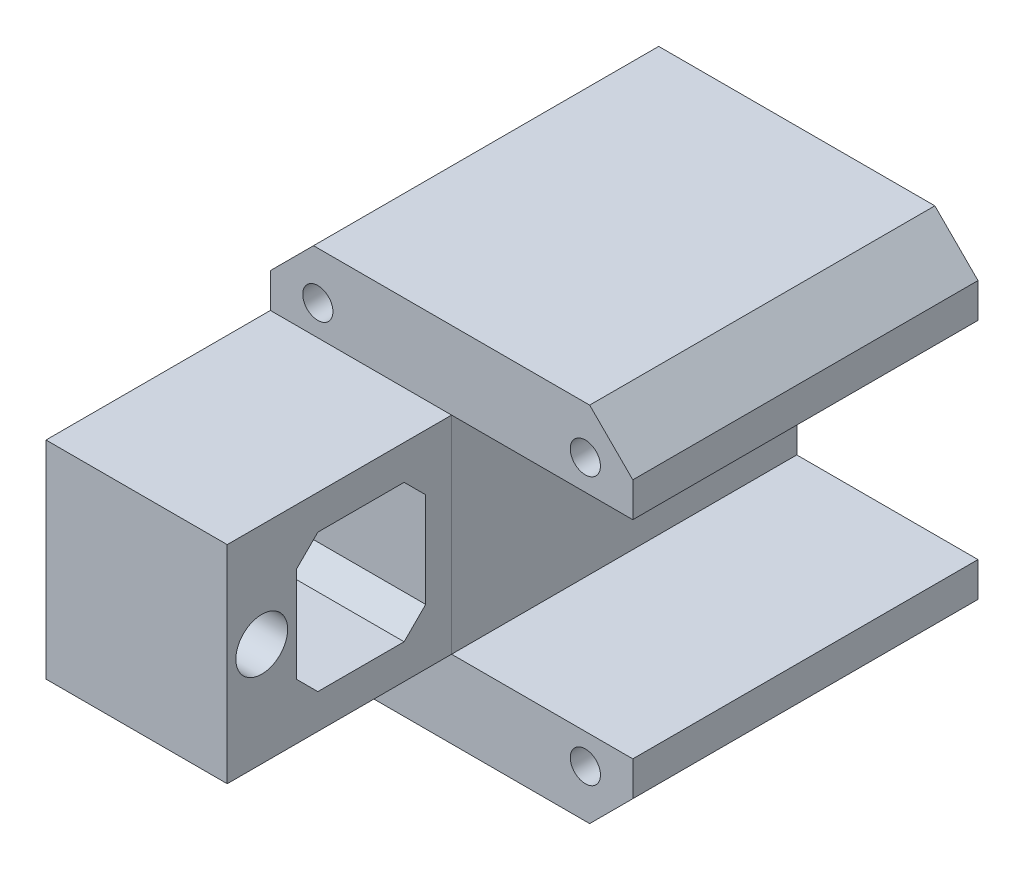
ISO-10303-21;
HEADER;
FILE_DESCRIPTION(('STEP AP214'),'2;1');
FILE_NAME('part.step','',(''),(''),'','','');
FILE_SCHEMA(('AUTOMOTIVE_DESIGN { 1 0 10303 214 1 1 1 1 }'));
ENDSEC;
DATA;
#1=APPLICATION_CONTEXT('core data for automotive mechanical design processes');
#2=APPLICATION_PROTOCOL_DEFINITION('international standard','automotive_design',2000,#1);
#3=PRODUCT_CONTEXT('',#1,'mechanical');
#4=PRODUCT('Part','Part','',(#3));
#5=PRODUCT_RELATED_PRODUCT_CATEGORY('part','',(#4));
#6=PRODUCT_DEFINITION_FORMATION('','',#4);
#7=PRODUCT_DEFINITION_CONTEXT('part definition',#1,'design');
#8=PRODUCT_DEFINITION('design','',#6,#7);
#9=PRODUCT_DEFINITION_SHAPE('','',#8);
#10=(LENGTH_UNIT() NAMED_UNIT(*) SI_UNIT(.MILLI.,.METRE.));
#11=(NAMED_UNIT(*) PLANE_ANGLE_UNIT() SI_UNIT($,.RADIAN.));
#12=(NAMED_UNIT(*) SI_UNIT($,.STERADIAN.) SOLID_ANGLE_UNIT());
#13=UNCERTAINTY_MEASURE_WITH_UNIT(LENGTH_MEASURE(1.E-05),#10,'distance_accuracy_value','');
#14=(GEOMETRIC_REPRESENTATION_CONTEXT(3) GLOBAL_UNCERTAINTY_ASSIGNED_CONTEXT((#13)) GLOBAL_UNIT_ASSIGNED_CONTEXT((#10,
#11,#12)) REPRESENTATION_CONTEXT('',''));
#15=CARTESIAN_POINT('',(0.,0.,0.));
#16=DIRECTION('',(0.,0.,1.));
#17=DIRECTION('',(1.,0.,0.));
#18=AXIS2_PLACEMENT_3D('',#15,#16,#17);
#19=CARTESIAN_POINT('',(0.,12.,40.));
#20=DIRECTION('',(0.,0.,-1.));
#21=DIRECTION('',(-1.,0.,0.));
#22=AXIS2_PLACEMENT_3D('',#19,#20,#21);
#23=PLANE('',#22);
#24=DIRECTION('',(0.,-1.,0.));
#25=VECTOR('',#24,1.);
#26=CARTESIAN_POINT('',(-21.,12.,40.));
#27=LINE('',#26,#25);
#28=CARTESIAN_POINT('',(-21.,12.,40.));
#29=VERTEX_POINT('',#28);
#30=CARTESIAN_POINT('',(-21.,-12.,40.));
#31=VERTEX_POINT('',#30);
#32=EDGE_CURVE('E168',#29,#31,#27,.T.);
#33=ORIENTED_EDGE('',*,*,#32,.F.);
#34=DIRECTION('',(-1.,0.,0.));
#35=VECTOR('',#34,1.);
#36=CARTESIAN_POINT('',(0.,12.,40.));
#37=LINE('',#36,#35);
#38=CARTESIAN_POINT('',(0.,12.,40.));
#39=VERTEX_POINT('',#38);
#40=EDGE_CURVE('E156',#39,#29,#37,.T.);
#41=ORIENTED_EDGE('',*,*,#40,.F.);
#42=DIRECTION('',(0.,-1.,0.));
#43=VECTOR('',#42,1.);
#44=CARTESIAN_POINT('',(0.,12.,40.));
#45=LINE('',#44,#43);
#46=CARTESIAN_POINT('',(0.,-12.,40.));
#47=VERTEX_POINT('',#46);
#48=EDGE_CURVE('E151',#39,#47,#45,.T.);
#49=ORIENTED_EDGE('',*,*,#48,.T.);
#50=DIRECTION('',(-1.,0.,0.));
#51=VECTOR('',#50,1.);
#52=CARTESIAN_POINT('',(0.,-12.,40.));
#53=LINE('',#52,#51);
#54=EDGE_CURVE('E133',#47,#31,#53,.T.);
#55=ORIENTED_EDGE('',*,*,#54,.T.);
#56=EDGE_LOOP('',(#33,#41,#49,#55));
#57=FACE_BOUND('',#56,.T.);
#58=ADVANCED_FACE('F43',(#57),#23,.T.);
#59=CARTESIAN_POINT('',(0.,12.,40.));
#60=DIRECTION('',(0.,1.,0.));
#61=DIRECTION('',(0.,0.,1.));
#62=AXIS2_PLACEMENT_3D('',#59,#60,#61);
#63=PLANE('',#62);
#64=DIRECTION('',(0.,0.,-1.));
#65=VECTOR('',#64,1.);
#66=CARTESIAN_POINT('',(-21.,12.,40.));
#67=LINE('',#66,#65);
#68=CARTESIAN_POINT('',(-21.,12.,66.));
#69=VERTEX_POINT('',#68);
#70=EDGE_CURVE('E157',#69,#29,#67,.T.);
#71=ORIENTED_EDGE('',*,*,#70,.F.);
#72=DIRECTION('',(-1.,0.,0.));
#73=VECTOR('',#72,1.);
#74=CARTESIAN_POINT('',(0.,12.,66.));
#75=LINE('',#74,#73);
#76=CARTESIAN_POINT('',(0.,12.,66.));
#77=VERTEX_POINT('',#76);
#78=EDGE_CURVE('E176',#77,#69,#75,.T.);
#79=ORIENTED_EDGE('',*,*,#78,.F.);
#80=DIRECTION('',(0.,0.,-1.));
#81=VECTOR('',#80,1.);
#82=CARTESIAN_POINT('',(0.,12.,40.));
#83=LINE('',#82,#81);
#84=EDGE_CURVE('E144',#77,#39,#83,.T.);
#85=ORIENTED_EDGE('',*,*,#84,.T.);
#86=ORIENTED_EDGE('',*,*,#40,.T.);
#87=EDGE_LOOP('',(#71,#79,#85,#86));
#88=FACE_BOUND('',#87,.T.);
#89=ADVANCED_FACE('F256',(#88),#63,.T.);
#90=CARTESIAN_POINT('',(0.,12.,66.));
#91=DIRECTION('',(0.,0.,1.));
#92=DIRECTION('',(1.,0.,0.));
#93=AXIS2_PLACEMENT_3D('',#90,#91,#92);
#94=PLANE('',#93);
#95=DIRECTION('',(0.,1.,0.));
#96=VECTOR('',#95,1.);
#97=CARTESIAN_POINT('',(-21.,12.,66.));
#98=LINE('',#97,#96);
#99=CARTESIAN_POINT('',(-21.,-12.,66.));
#100=VERTEX_POINT('',#99);
#101=EDGE_CURVE('E160',#100,#69,#98,.T.);
#102=ORIENTED_EDGE('',*,*,#101,.F.);
#103=DIRECTION('',(-1.,0.,0.));
#104=VECTOR('',#103,1.);
#105=CARTESIAN_POINT('',(0.,-12.,66.));
#106=LINE('',#105,#104);
#107=CARTESIAN_POINT('',(0.,-12.,66.));
#108=VERTEX_POINT('',#107);
#109=EDGE_CURVE('E143',#108,#100,#106,.T.);
#110=ORIENTED_EDGE('',*,*,#109,.F.);
#111=DIRECTION('',(0.,1.,0.));
#112=VECTOR('',#111,1.);
#113=CARTESIAN_POINT('',(0.,12.,66.));
#114=LINE('',#113,#112);
#115=EDGE_CURVE('E154',#108,#77,#114,.T.);
#116=ORIENTED_EDGE('',*,*,#115,.T.);
#117=ORIENTED_EDGE('',*,*,#78,.T.);
#118=EDGE_LOOP('',(#102,#110,#116,#117));
#119=FACE_BOUND('',#118,.T.);
#120=ADVANCED_FACE('F261',(#119),#94,.T.);
#121=CARTESIAN_POINT('',(0.,-12.,40.));
#122=DIRECTION('',(0.,-1.,0.));
#123=DIRECTION('',(0.,0.,-1.));
#124=AXIS2_PLACEMENT_3D('',#121,#122,#123);
#125=PLANE('',#124);
#126=DIRECTION('',(0.,0.,1.));
#127=VECTOR('',#126,1.);
#128=CARTESIAN_POINT('',(-21.,-12.,40.));
#129=LINE('',#128,#127);
#130=EDGE_CURVE('E138',#31,#100,#129,.T.);
#131=ORIENTED_EDGE('',*,*,#130,.F.);
#132=ORIENTED_EDGE('',*,*,#54,.F.);
#133=DIRECTION('',(0.,0.,1.));
#134=VECTOR('',#133,1.);
#135=CARTESIAN_POINT('',(0.,-12.,40.));
#136=LINE('',#135,#134);
#137=EDGE_CURVE('E136',#47,#108,#136,.T.);
#138=ORIENTED_EDGE('',*,*,#137,.T.);
#139=ORIENTED_EDGE('',*,*,#109,.T.);
#140=EDGE_LOOP('',(#131,#132,#138,#139));
#141=FACE_BOUND('',#140,.T.);
#142=ADVANCED_FACE('F135',(#141),#125,.T.);
#143=CARTESIAN_POINT('',(0.,0.,0.));
#144=DIRECTION('',(-1.,0.,0.));
#145=DIRECTION('',(0.,0.,1.));
#146=AXIS2_PLACEMENT_3D('',#143,#144,#145);
#147=PLANE('',#146);
#148=CARTESIAN_POINT('',(0.,0.,62.));
#149=DIRECTION('',(1.,0.,0.));
#150=DIRECTION('',(0.,0.,-1.));
#151=AXIS2_PLACEMENT_3D('',#148,#149,#150);
#152=CIRCLE('',#151,3.);
#153=CARTESIAN_POINT('',(0.,0.,59.));
#154=VERTEX_POINT('',#153);
#155=EDGE_CURVE('E283',#154,#154,#152,.T.);
#156=ORIENTED_EDGE('',*,*,#155,.F.);
#157=EDGE_LOOP('',(#156));
#158=FACE_BOUND('',#157,.T.);
#159=DIRECTION('',(0.,1.,0.));
#160=VECTOR('',#159,1.);
#161=CARTESIAN_POINT('',(0.,8.,58.));
#162=LINE('',#161,#160);
#163=CARTESIAN_POINT('',(0.,-5.49999999999998,58.));
#164=VERTEX_POINT('',#163);
#165=CARTESIAN_POINT('',(0.,5.50000000000001,58.));
#166=VERTEX_POINT('',#165);
#167=EDGE_CURVE('E224',#164,#166,#162,.T.);
#168=ORIENTED_EDGE('',*,*,#167,.T.);
#169=DIRECTION('',(0.,-0.707106781186544,0.707106781186551));
#170=VECTOR('',#169,1.);
#171=CARTESIAN_POINT('',(0.,31.75,31.7499999999997));
#172=LINE('',#171,#170);
#173=CARTESIAN_POINT('',(0.,8.,55.5));
#174=VERTEX_POINT('',#173);
#175=EDGE_CURVE('E12',#166,#174,#172,.F.);
#176=ORIENTED_EDGE('',*,*,#175,.T.);
#177=DIRECTION('',(0.,0.,-1.));
#178=VECTOR('',#177,1.);
#179=CARTESIAN_POINT('',(0.,8.,43.));
#180=LINE('',#179,#178);
#181=CARTESIAN_POINT('',(0.,8.,45.5));
#182=VERTEX_POINT('',#181);
#183=EDGE_CURVE('E170',#174,#182,#180,.T.);
#184=ORIENTED_EDGE('',*,*,#183,.T.);
#185=DIRECTION('',(0.,0.707106781186551,0.707106781186544));
#186=VECTOR('',#185,1.);
#187=CARTESIAN_POINT('',(0.,-18.75,18.7500000000002));
#188=LINE('',#187,#186);
#189=CARTESIAN_POINT('',(0.,5.49999999999999,43.));
#190=VERTEX_POINT('',#189);
#191=EDGE_CURVE('E203',#182,#190,#188,.F.);
#192=ORIENTED_EDGE('',*,*,#191,.T.);
#193=DIRECTION('',(0.,-1.,0.));
#194=VECTOR('',#193,1.);
#195=CARTESIAN_POINT('',(0.,8.,43.));
#196=LINE('',#195,#194);
#197=CARTESIAN_POINT('',(0.,-5.50000000000001,43.));
#198=VERTEX_POINT('',#197);
#199=EDGE_CURVE('E280',#190,#198,#196,.T.);
#200=ORIENTED_EDGE('',*,*,#199,.T.);
#201=DIRECTION('',(0.,0.707106781186544,-0.707106781186551));
#202=VECTOR('',#201,1.);
#203=CARTESIAN_POINT('',(0.,18.75,18.7499999999998));
#204=LINE('',#203,#202);
#205=CARTESIAN_POINT('',(0.,-8.,45.5));
#206=VERTEX_POINT('',#205);
#207=EDGE_CURVE('E199',#198,#206,#204,.F.);
#208=ORIENTED_EDGE('',*,*,#207,.T.);
#209=DIRECTION('',(0.,0.,1.));
#210=VECTOR('',#209,1.);
#211=CARTESIAN_POINT('',(0.,-8.,43.));
#212=LINE('',#211,#210);
#213=CARTESIAN_POINT('',(0.,-8.,55.5));
#214=VERTEX_POINT('',#213);
#215=EDGE_CURVE('E229',#206,#214,#212,.T.);
#216=ORIENTED_EDGE('',*,*,#215,.T.);
#217=DIRECTION('',(0.,-0.707106781186551,-0.707106781186544));
#218=VECTOR('',#217,1.);
#219=CARTESIAN_POINT('',(0.,-31.75,31.7500000000003));
#220=LINE('',#219,#218);
#221=EDGE_CURVE('E65',#214,#164,#220,.F.);
#222=ORIENTED_EDGE('',*,*,#221,.T.);
#223=EDGE_LOOP('',(#168,#176,#184,#192,#200,#208,#216,#222));
#224=FACE_BOUND('',#223,.T.);
#225=ORIENTED_EDGE('',*,*,#48,.F.);
#226=ORIENTED_EDGE('',*,*,#84,.F.);
#227=ORIENTED_EDGE('',*,*,#115,.F.);
#228=ORIENTED_EDGE('',*,*,#137,.F.);
#229=EDGE_LOOP('',(#225,#226,#227,#228));
#230=FACE_BOUND('',#229,.T.);
#231=ADVANCED_FACE('F149',(#158,#224,#230),#147,.F.);
#232=CARTESIAN_POINT('',(-21.,0.,0.));
#233=DIRECTION('',(-1.,0.,0.));
#234=DIRECTION('',(0.,0.,1.));
#235=AXIS2_PLACEMENT_3D('',#232,#233,#234);
#236=PLANE('',#235);
#237=DIRECTION('',(0.,-1.,0.));
#238=VECTOR('',#237,1.);
#239=CARTESIAN_POINT('',(-21.,8.,43.));
#240=LINE('',#239,#238);
#241=CARTESIAN_POINT('',(-21.,5.49999999999999,43.));
#242=VERTEX_POINT('',#241);
#243=CARTESIAN_POINT('',(-21.,-5.50000000000001,43.));
#244=VERTEX_POINT('',#243);
#245=EDGE_CURVE('E233',#242,#244,#240,.T.);
#246=ORIENTED_EDGE('',*,*,#245,.F.);
#247=DIRECTION('',(0.,-0.707106781186551,-0.707106781186544));
#248=VECTOR('',#247,1.);
#249=CARTESIAN_POINT('',(-21.,5.49999999999999,43.));
#250=LINE('',#249,#248);
#251=CARTESIAN_POINT('',(-21.,8.,45.5));
#252=VERTEX_POINT('',#251);
#253=EDGE_CURVE('E201',#242,#252,#250,.F.);
#254=ORIENTED_EDGE('',*,*,#253,.T.);
#255=DIRECTION('',(0.,0.,-1.));
#256=VECTOR('',#255,1.);
#257=CARTESIAN_POINT('',(-21.,8.,43.));
#258=LINE('',#257,#256);
#259=CARTESIAN_POINT('',(-21.,8.,55.5));
#260=VERTEX_POINT('',#259);
#261=EDGE_CURVE('E163',#260,#252,#258,.T.);
#262=ORIENTED_EDGE('',*,*,#261,.F.);
#263=DIRECTION('',(0.,0.707106781186544,-0.707106781186551));
#264=VECTOR('',#263,1.);
#265=CARTESIAN_POINT('',(-21.,8.,55.5));
#266=LINE('',#265,#264);
#267=CARTESIAN_POINT('',(-21.,5.50000000000001,58.));
#268=VERTEX_POINT('',#267);
#269=EDGE_CURVE('E51',#260,#268,#266,.F.);
#270=ORIENTED_EDGE('',*,*,#269,.T.);
#271=DIRECTION('',(0.,1.,0.));
#272=VECTOR('',#271,1.);
#273=CARTESIAN_POINT('',(-21.,8.,58.));
#274=LINE('',#273,#272);
#275=CARTESIAN_POINT('',(-21.,-5.49999999999998,58.));
#276=VERTEX_POINT('',#275);
#277=EDGE_CURVE('E213',#276,#268,#274,.T.);
#278=ORIENTED_EDGE('',*,*,#277,.F.);
#279=DIRECTION('',(0.,0.707106781186551,0.707106781186544));
#280=VECTOR('',#279,1.);
#281=CARTESIAN_POINT('',(-21.,-5.49999999999998,58.));
#282=LINE('',#281,#280);
#283=CARTESIAN_POINT('',(-21.,-8.,55.5));
#284=VERTEX_POINT('',#283);
#285=EDGE_CURVE('E205',#276,#284,#282,.F.);
#286=ORIENTED_EDGE('',*,*,#285,.T.);
#287=DIRECTION('',(0.,0.,1.));
#288=VECTOR('',#287,1.);
#289=CARTESIAN_POINT('',(-21.,-8.,43.));
#290=LINE('',#289,#288);
#291=CARTESIAN_POINT('',(-21.,-8.,45.5));
#292=VERTEX_POINT('',#291);
#293=EDGE_CURVE('E219',#292,#284,#290,.T.);
#294=ORIENTED_EDGE('',*,*,#293,.F.);
#295=DIRECTION('',(0.,-0.707106781186544,0.707106781186551));
#296=VECTOR('',#295,1.);
#297=CARTESIAN_POINT('',(-21.,-8.,45.5));
#298=LINE('',#297,#296);
#299=EDGE_CURVE('E197',#292,#244,#298,.F.);
#300=ORIENTED_EDGE('',*,*,#299,.T.);
#301=EDGE_LOOP('',(#246,#254,#262,#270,#278,#286,#294,#300));
#302=FACE_BOUND('',#301,.T.);
#303=ORIENTED_EDGE('',*,*,#32,.T.);
#304=ORIENTED_EDGE('',*,*,#130,.T.);
#305=ORIENTED_EDGE('',*,*,#101,.T.);
#306=ORIENTED_EDGE('',*,*,#70,.T.);
#307=EDGE_LOOP('',(#303,#304,#305,#306));
#308=FACE_BOUND('',#307,.T.);
#309=ADVANCED_FACE('F211',(#302,#308),#236,.T.);
#310=CARTESIAN_POINT('',(0.,8.,43.));
#311=DIRECTION('',(0.,0.,-1.));
#312=DIRECTION('',(-1.,0.,0.));
#313=AXIS2_PLACEMENT_3D('',#310,#311,#312);
#314=PLANE('',#313);
#315=ORIENTED_EDGE('',*,*,#245,.T.);
#316=DIRECTION('',(1.,0.,0.));
#317=VECTOR('',#316,1.);
#318=CARTESIAN_POINT('',(0.,-5.50000000000001,43.));
#319=LINE('',#318,#317);
#320=EDGE_CURVE('E186',#244,#198,#319,.T.);
#321=ORIENTED_EDGE('',*,*,#320,.T.);
#322=ORIENTED_EDGE('',*,*,#199,.F.);
#323=DIRECTION('',(-1.,0.,0.));
#324=VECTOR('',#323,1.);
#325=CARTESIAN_POINT('',(-21.,5.49999999999999,43.));
#326=LINE('',#325,#324);
#327=EDGE_CURVE('E183',#190,#242,#326,.T.);
#328=ORIENTED_EDGE('',*,*,#327,.T.);
#329=EDGE_LOOP('',(#315,#321,#322,#328));
#330=FACE_BOUND('',#329,.T.);
#331=ADVANCED_FACE('F300',(#330),#314,.F.);
#332=CARTESIAN_POINT('',(0.,8.,43.));
#333=DIRECTION('',(0.,1.,0.));
#334=DIRECTION('',(0.,0.,1.));
#335=AXIS2_PLACEMENT_3D('',#332,#333,#334);
#336=PLANE('',#335);
#337=ORIENTED_EDGE('',*,*,#261,.T.);
#338=DIRECTION('',(1.,0.,0.));
#339=VECTOR('',#338,1.);
#340=CARTESIAN_POINT('',(0.,8.,45.5));
#341=LINE('',#340,#339);
#342=EDGE_CURVE('E191',#252,#182,#341,.T.);
#343=ORIENTED_EDGE('',*,*,#342,.T.);
#344=ORIENTED_EDGE('',*,*,#183,.F.);
#345=DIRECTION('',(-1.,0.,0.));
#346=VECTOR('',#345,1.);
#347=CARTESIAN_POINT('',(-21.,8.,55.5));
#348=LINE('',#347,#346);
#349=EDGE_CURVE('E188',#174,#260,#348,.T.);
#350=ORIENTED_EDGE('',*,*,#349,.T.);
#351=EDGE_LOOP('',(#337,#343,#344,#350));
#352=FACE_BOUND('',#351,.T.);
#353=ADVANCED_FACE('F226',(#352),#336,.F.);
#354=CARTESIAN_POINT('',(0.,8.,58.));
#355=DIRECTION('',(0.,0.,1.));
#356=DIRECTION('',(1.,0.,0.));
#357=AXIS2_PLACEMENT_3D('',#354,#355,#356);
#358=PLANE('',#357);
#359=ORIENTED_EDGE('',*,*,#167,.F.);
#360=DIRECTION('',(-1.,0.,0.));
#361=VECTOR('',#360,1.);
#362=CARTESIAN_POINT('',(-21.,-5.49999999999998,58.));
#363=LINE('',#362,#361);
#364=EDGE_CURVE('E194',#164,#276,#363,.T.);
#365=ORIENTED_EDGE('',*,*,#364,.T.);
#366=ORIENTED_EDGE('',*,*,#277,.T.);
#367=DIRECTION('',(1.,0.,0.));
#368=VECTOR('',#367,1.);
#369=CARTESIAN_POINT('',(0.,5.50000000000001,58.));
#370=LINE('',#369,#368);
#371=EDGE_CURVE('E58',#268,#166,#370,.T.);
#372=ORIENTED_EDGE('',*,*,#371,.T.);
#373=EDGE_LOOP('',(#359,#365,#366,#372));
#374=FACE_BOUND('',#373,.T.);
#375=ADVANCED_FACE('F217',(#374),#358,.F.);
#376=CARTESIAN_POINT('',(0.,-8.,43.));
#377=DIRECTION('',(0.,-1.,0.));
#378=DIRECTION('',(0.,0.,-1.));
#379=AXIS2_PLACEMENT_3D('',#376,#377,#378);
#380=PLANE('',#379);
#381=ORIENTED_EDGE('',*,*,#215,.F.);
#382=DIRECTION('',(-1.,0.,0.));
#383=VECTOR('',#382,1.);
#384=CARTESIAN_POINT('',(-21.,-8.,45.5));
#385=LINE('',#384,#383);
#386=EDGE_CURVE('E180',#206,#292,#385,.T.);
#387=ORIENTED_EDGE('',*,*,#386,.T.);
#388=ORIENTED_EDGE('',*,*,#293,.T.);
#389=DIRECTION('',(1.,0.,0.));
#390=VECTOR('',#389,1.);
#391=CARTESIAN_POINT('',(0.,-8.,55.5));
#392=LINE('',#391,#390);
#393=EDGE_CURVE('E175',#284,#214,#392,.T.);
#394=ORIENTED_EDGE('',*,*,#393,.T.);
#395=EDGE_LOOP('',(#381,#387,#388,#394));
#396=FACE_BOUND('',#395,.T.);
#397=ADVANCED_FACE('F242',(#396),#380,.F.);
#398=CARTESIAN_POINT('',(-10.,0.,62.));
#399=DIRECTION('',(1.,0.,0.));
#400=DIRECTION('',(0.,0.,-1.));
#401=AXIS2_PLACEMENT_3D('',#398,#399,#400);
#402=CYLINDRICAL_SURFACE('',#401,3.);
#403=CARTESIAN_POINT('',(-10.,0.,62.));
#404=DIRECTION('',(1.,0.,0.));
#405=DIRECTION('',(0.,0.,-1.));
#406=AXIS2_PLACEMENT_3D('',#403,#404,#405);
#407=CIRCLE('',#406,3.);
#408=CARTESIAN_POINT('',(-10.,0.,59.));
#409=VERTEX_POINT('',#408);
#410=EDGE_CURVE('E236',#409,#409,#407,.T.);
#411=ORIENTED_EDGE('',*,*,#410,.F.);
#412=EDGE_LOOP('',(#411));
#413=FACE_BOUND('',#412,.T.);
#414=ORIENTED_EDGE('',*,*,#155,.T.);
#415=EDGE_LOOP('',(#414));
#416=FACE_BOUND('',#415,.T.);
#417=ADVANCED_FACE('F273',(#413,#416),#402,.F.);
#418=CARTESIAN_POINT('',(-10.,0.,62.));
#419=DIRECTION('',(1.,0.,0.));
#420=DIRECTION('',(0.,0.,-1.));
#421=AXIS2_PLACEMENT_3D('',#418,#419,#420);
#422=PLANE('',#421);
#423=ORIENTED_EDGE('',*,*,#410,.T.);
#424=EDGE_LOOP('',(#423));
#425=FACE_BOUND('',#424,.T.);
#426=ADVANCED_FACE('F268',(#425),#422,.T.);
#427=CARTESIAN_POINT('',(0.,-8.,45.5));
#428=DIRECTION('',(0.,0.707106781186551,0.707106781186543));
#429=DIRECTION('',(1.,0.,0.));
#430=AXIS2_PLACEMENT_3D('',#427,#428,#429);
#431=PLANE('',#430);
#432=ORIENTED_EDGE('',*,*,#207,.F.);
#433=ORIENTED_EDGE('',*,*,#320,.F.);
#434=ORIENTED_EDGE('',*,*,#299,.F.);
#435=ORIENTED_EDGE('',*,*,#386,.F.);
#436=EDGE_LOOP('',(#432,#433,#434,#435));
#437=FACE_BOUND('',#436,.T.);
#438=ADVANCED_FACE('F252',(#437),#431,.T.);
#439=CARTESIAN_POINT('',(0.,5.49999999999999,43.));
#440=DIRECTION('',(0.,-0.707106781186544,0.707106781186551));
#441=DIRECTION('',(1.,0.,0.));
#442=AXIS2_PLACEMENT_3D('',#439,#440,#441);
#443=PLANE('',#442);
#444=ORIENTED_EDGE('',*,*,#191,.F.);
#445=ORIENTED_EDGE('',*,*,#342,.F.);
#446=ORIENTED_EDGE('',*,*,#253,.F.);
#447=ORIENTED_EDGE('',*,*,#327,.F.);
#448=EDGE_LOOP('',(#444,#445,#446,#447));
#449=FACE_BOUND('',#448,.T.);
#450=ADVANCED_FACE('F247',(#449),#443,.T.);
#451=CARTESIAN_POINT('',(0.,-5.49999999999998,58.));
#452=DIRECTION('',(0.,0.707106781186543,-0.707106781186551));
#453=DIRECTION('',(1.,0.,0.));
#454=AXIS2_PLACEMENT_3D('',#451,#452,#453);
#455=PLANE('',#454);
#456=ORIENTED_EDGE('',*,*,#221,.F.);
#457=ORIENTED_EDGE('',*,*,#393,.F.);
#458=ORIENTED_EDGE('',*,*,#285,.F.);
#459=ORIENTED_EDGE('',*,*,#364,.F.);
#460=EDGE_LOOP('',(#456,#457,#458,#459));
#461=FACE_BOUND('',#460,.T.);
#462=ADVANCED_FACE('F245',(#461),#455,.T.);
#463=CARTESIAN_POINT('',(0.,8.,55.5));
#464=DIRECTION('',(0.,-0.707106781186551,-0.707106781186544));
#465=DIRECTION('',(1.,0.,0.));
#466=AXIS2_PLACEMENT_3D('',#463,#464,#465);
#467=PLANE('',#466);
#468=ORIENTED_EDGE('',*,*,#175,.F.);
#469=ORIENTED_EDGE('',*,*,#371,.F.);
#470=ORIENTED_EDGE('',*,*,#269,.F.);
#471=ORIENTED_EDGE('',*,*,#349,.F.);
#472=EDGE_LOOP('',(#468,#469,#470,#471));
#473=FACE_BOUND('',#472,.T.);
#474=ADVANCED_FACE('F45',(#473),#467,.T.);
#475=CLOSED_SHELL('',(#58,#89,#120,#142,#231,#309,#331,#353,#375,#397,#417,#426,#438,#450,#462,#474));
#476=MANIFOLD_SOLID_BREP('B2',#475);
#477=CARTESIAN_POINT('',(21.,21.,40.));
#478=DIRECTION('',(-1.,0.,0.));
#479=DIRECTION('',(0.,0.,1.));
#480=AXIS2_PLACEMENT_3D('',#477,#478,#479);
#481=PLANE('',#480);
#482=DIRECTION('',(0.,1.,0.));
#483=VECTOR('',#482,1.);
#484=CARTESIAN_POINT('',(21.,21.,40.));
#485=LINE('',#484,#483);
#486=CARTESIAN_POINT('',(21.,12.,40.));
#487=VERTEX_POINT('',#486);
#488=CARTESIAN_POINT('',(21.,16.,40.));
#489=VERTEX_POINT('',#488);
#490=EDGE_CURVE('E558',#487,#489,#485,.T.);
#491=ORIENTED_EDGE('',*,*,#490,.F.);
#492=DIRECTION('',(0.,0.,1.));
#493=VECTOR('',#492,1.);
#494=CARTESIAN_POINT('',(21.,12.,40.));
#495=LINE('',#494,#493);
#496=CARTESIAN_POINT('',(21.,12.,0.));
#497=VERTEX_POINT('',#496);
#498=EDGE_CURVE('E512',#497,#487,#495,.T.);
#499=ORIENTED_EDGE('',*,*,#498,.F.);
#500=DIRECTION('',(0.,1.,0.));
#501=VECTOR('',#500,1.);
#502=CARTESIAN_POINT('',(21.,21.,0.));
#503=LINE('',#502,#501);
#504=CARTESIAN_POINT('',(21.,16.,0.));
#505=VERTEX_POINT('',#504);
#506=EDGE_CURVE('E568',#497,#505,#503,.T.);
#507=ORIENTED_EDGE('',*,*,#506,.T.);
#508=DIRECTION('',(0.,0.,1.));
#509=VECTOR('',#508,1.);
#510=CARTESIAN_POINT('',(21.,16.,40.));
#511=LINE('',#510,#509);
#512=EDGE_CURVE('E599',#505,#489,#511,.T.);
#513=ORIENTED_EDGE('',*,*,#512,.T.);
#514=EDGE_LOOP('',(#491,#499,#507,#513));
#515=FACE_BOUND('',#514,.T.);
#516=ADVANCED_FACE('F407',(#515),#481,.F.);
#517=CARTESIAN_POINT('',(-21.,21.,40.));
#518=DIRECTION('',(1.,0.,0.));
#519=DIRECTION('',(0.,0.,-1.));
#520=AXIS2_PLACEMENT_3D('',#517,#518,#519);
#521=PLANE('',#520);
#522=DIRECTION('',(0.,-1.,0.));
#523=VECTOR('',#522,1.);
#524=CARTESIAN_POINT('',(-21.,21.,0.));
#525=LINE('',#524,#523);
#526=CARTESIAN_POINT('',(-21.,16.,0.));
#527=VERTEX_POINT('',#526);
#528=CARTESIAN_POINT('',(-21.,-16.,0.));
#529=VERTEX_POINT('',#528);
#530=EDGE_CURVE('E548',#527,#529,#525,.T.);
#531=ORIENTED_EDGE('',*,*,#530,.T.);
#532=DIRECTION('',(0.,0.,1.));
#533=VECTOR('',#532,1.);
#534=CARTESIAN_POINT('',(-21.,-16.,40.));
#535=LINE('',#534,#533);
#536=CARTESIAN_POINT('',(-21.,-16.,40.));
#537=VERTEX_POINT('',#536);
#538=EDGE_CURVE('E589',#529,#537,#535,.T.);
#539=ORIENTED_EDGE('',*,*,#538,.T.);
#540=DIRECTION('',(0.,-1.,0.));
#541=VECTOR('',#540,1.);
#542=CARTESIAN_POINT('',(-21.,21.,40.));
#543=LINE('',#542,#541);
#544=CARTESIAN_POINT('',(-21.,16.,40.));
#545=VERTEX_POINT('',#544);
#546=EDGE_CURVE('E551',#545,#537,#543,.T.);
#547=ORIENTED_EDGE('',*,*,#546,.F.);
#548=DIRECTION('',(0.,0.,-1.));
#549=VECTOR('',#548,1.);
#550=CARTESIAN_POINT('',(-21.,16.,40.));
#551=LINE('',#550,#549);
#552=EDGE_CURVE('E586',#545,#527,#551,.T.);
#553=ORIENTED_EDGE('',*,*,#552,.T.);
#554=EDGE_LOOP('',(#531,#539,#547,#553));
#555=FACE_BOUND('',#554,.T.);
#556=ADVANCED_FACE('F639',(#555),#521,.F.);
#557=CARTESIAN_POINT('',(-21.,-21.,40.));
#558=DIRECTION('',(0.,1.,0.));
#559=DIRECTION('',(0.,0.,1.));
#560=AXIS2_PLACEMENT_3D('',#557,#558,#559);
#561=PLANE('',#560);
#562=DIRECTION('',(1.,0.,0.));
#563=VECTOR('',#562,1.);
#564=CARTESIAN_POINT('',(-21.,-21.,40.));
#565=LINE('',#564,#563);
#566=CARTESIAN_POINT('',(-16.,-21.,40.));
#567=VERTEX_POINT('',#566);
#568=CARTESIAN_POINT('',(16.,-21.,40.));
#569=VERTEX_POINT('',#568);
#570=EDGE_CURVE('E554',#567,#569,#565,.T.);
#571=ORIENTED_EDGE('',*,*,#570,.F.);
#572=DIRECTION('',(0.,0.,-1.));
#573=VECTOR('',#572,1.);
#574=CARTESIAN_POINT('',(-16.,-21.,40.));
#575=LINE('',#574,#573);
#576=CARTESIAN_POINT('',(-16.,-21.,0.));
#577=VERTEX_POINT('',#576);
#578=EDGE_CURVE('E574',#567,#577,#575,.T.);
#579=ORIENTED_EDGE('',*,*,#578,.T.);
#580=DIRECTION('',(1.,0.,0.));
#581=VECTOR('',#580,1.);
#582=CARTESIAN_POINT('',(-21.,-21.,0.));
#583=LINE('',#582,#581);
#584=CARTESIAN_POINT('',(16.,-21.,0.));
#585=VERTEX_POINT('',#584);
#586=EDGE_CURVE('E565',#577,#585,#583,.T.);
#587=ORIENTED_EDGE('',*,*,#586,.T.);
#588=DIRECTION('',(0.,0.,1.));
#589=VECTOR('',#588,1.);
#590=CARTESIAN_POINT('',(16.,-21.,40.));
#591=LINE('',#590,#589);
#592=EDGE_CURVE('E562',#585,#569,#591,.T.);
#593=ORIENTED_EDGE('',*,*,#592,.T.);
#594=EDGE_LOOP('',(#571,#579,#587,#593));
#595=FACE_BOUND('',#594,.T.);
#596=ADVANCED_FACE('F647',(#595),#561,.F.);
#597=CARTESIAN_POINT('',(21.,-16.,0.));
#598=VERTEX_POINT('',#597);
#599=CARTESIAN_POINT('',(21.,-12.,0.));
#600=VERTEX_POINT('',#599);
#601=EDGE_CURVE('E569',#598,#600,#503,.T.);
#602=ORIENTED_EDGE('',*,*,#601,.T.);
#603=DIRECTION('',(0.,0.,-1.));
#604=VECTOR('',#603,1.);
#605=CARTESIAN_POINT('',(21.,-12.,40.));
#606=LINE('',#605,#604);
#607=CARTESIAN_POINT('',(21.,-12.,40.));
#608=VERTEX_POINT('',#607);
#609=EDGE_CURVE('E617',#608,#600,#606,.T.);
#610=ORIENTED_EDGE('',*,*,#609,.F.);
#611=CARTESIAN_POINT('',(21.,-16.,40.));
#612=VERTEX_POINT('',#611);
#613=EDGE_CURVE('E518',#612,#608,#485,.T.);
#614=ORIENTED_EDGE('',*,*,#613,.F.);
#615=DIRECTION('',(0.,0.,-1.));
#616=VECTOR('',#615,1.);
#617=CARTESIAN_POINT('',(21.,-16.,40.));
#618=LINE('',#617,#616);
#619=EDGE_CURVE('E602',#612,#598,#618,.T.);
#620=ORIENTED_EDGE('',*,*,#619,.T.);
#621=EDGE_LOOP('',(#602,#610,#614,#620));
#622=FACE_BOUND('',#621,.T.);
#623=ADVANCED_FACE('F607',(#622),#481,.F.);
#624=CARTESIAN_POINT('',(-21.,21.,40.));
#625=DIRECTION('',(0.,-1.,0.));
#626=DIRECTION('',(0.,0.,-1.));
#627=AXIS2_PLACEMENT_3D('',#624,#625,#626);
#628=PLANE('',#627);
#629=DIRECTION('',(-1.,0.,0.));
#630=VECTOR('',#629,1.);
#631=CARTESIAN_POINT('',(-21.,21.,40.));
#632=LINE('',#631,#630);
#633=CARTESIAN_POINT('',(16.,21.,40.));
#634=VERTEX_POINT('',#633);
#635=CARTESIAN_POINT('',(-16.,21.,40.));
#636=VERTEX_POINT('',#635);
#637=EDGE_CURVE('E560',#634,#636,#632,.T.);
#638=ORIENTED_EDGE('',*,*,#637,.F.);
#639=DIRECTION('',(0.,0.,-1.));
#640=VECTOR('',#639,1.);
#641=CARTESIAN_POINT('',(16.,21.,40.));
#642=LINE('',#641,#640);
#643=CARTESIAN_POINT('',(16.,21.,0.));
#644=VERTEX_POINT('',#643);
#645=EDGE_CURVE('E41',#634,#644,#642,.T.);
#646=ORIENTED_EDGE('',*,*,#645,.T.);
#647=DIRECTION('',(-1.,0.,0.));
#648=VECTOR('',#647,1.);
#649=CARTESIAN_POINT('',(-21.,21.,0.));
#650=LINE('',#649,#648);
#651=CARTESIAN_POINT('',(-16.,21.,0.));
#652=VERTEX_POINT('',#651);
#653=EDGE_CURVE('E555',#644,#652,#650,.T.);
#654=ORIENTED_EDGE('',*,*,#653,.T.);
#655=DIRECTION('',(0.,0.,1.));
#656=VECTOR('',#655,1.);
#657=CARTESIAN_POINT('',(-16.,21.,40.));
#658=LINE('',#657,#656);
#659=EDGE_CURVE('E415',#652,#636,#658,.T.);
#660=ORIENTED_EDGE('',*,*,#659,.T.);
#661=EDGE_LOOP('',(#638,#646,#654,#660));
#662=FACE_BOUND('',#661,.T.);
#663=ADVANCED_FACE('F633',(#662),#628,.F.);
#664=CARTESIAN_POINT('',(0.,0.,40.));
#665=DIRECTION('',(0.,0.,1.));
#666=DIRECTION('',(1.,0.,0.));
#667=AXIS2_PLACEMENT_3D('',#664,#665,#666);
#668=PLANE('',#667);
#669=DIRECTION('',(1.,0.,0.));
#670=VECTOR('',#669,1.);
#671=CARTESIAN_POINT('',(0.,12.,40.));
#672=LINE('',#671,#670);
#673=CARTESIAN_POINT('',(0.,12.,40.));
#674=VERTEX_POINT('',#673);
#675=EDGE_CURVE('E544',#674,#487,#672,.T.);
#676=ORIENTED_EDGE('',*,*,#675,.T.);
#677=ORIENTED_EDGE('',*,*,#490,.T.);
#678=DIRECTION('',(0.707106781186547,-0.707106781186549,0.));
#679=VECTOR('',#678,1.);
#680=CARTESIAN_POINT('',(18.5,18.5,40.));
#681=LINE('',#680,#679);
#682=EDGE_CURVE('E593',#489,#634,#681,.F.);
#683=ORIENTED_EDGE('',*,*,#682,.T.);
#684=ORIENTED_EDGE('',*,*,#637,.T.);
#685=DIRECTION('',(0.707106781186549,0.707106781186547,0.));
#686=VECTOR('',#685,1.);
#687=CARTESIAN_POINT('',(-18.5,18.5,40.));
#688=LINE('',#687,#686);
#689=EDGE_CURVE('E591',#636,#545,#688,.F.);
#690=ORIENTED_EDGE('',*,*,#689,.T.);
#691=ORIENTED_EDGE('',*,*,#546,.T.);
#692=DIRECTION('',(-0.707106781186547,0.707106781186549,0.));
#693=VECTOR('',#692,1.);
#694=CARTESIAN_POINT('',(-18.5,-18.5,40.));
#695=LINE('',#694,#693);
#696=EDGE_CURVE('E597',#537,#567,#695,.F.);
#697=ORIENTED_EDGE('',*,*,#696,.T.);
#698=ORIENTED_EDGE('',*,*,#570,.T.);
#699=DIRECTION('',(-0.707106781186549,-0.707106781186547,0.));
#700=VECTOR('',#699,1.);
#701=CARTESIAN_POINT('',(18.5,-18.5,40.));
#702=LINE('',#701,#700);
#703=EDGE_CURVE('E595',#569,#612,#702,.F.);
#704=ORIENTED_EDGE('',*,*,#703,.T.);
#705=ORIENTED_EDGE('',*,*,#613,.T.);
#706=DIRECTION('',(1.,0.,0.));
#707=VECTOR('',#706,1.);
#708=CARTESIAN_POINT('',(0.,-12.,40.));
#709=LINE('',#708,#707);
#710=CARTESIAN_POINT('',(0.,-12.,40.));
#711=VERTEX_POINT('',#710);
#712=EDGE_CURVE('E497',#711,#608,#709,.T.);
#713=ORIENTED_EDGE('',*,*,#712,.F.);
#714=DIRECTION('',(0.,-1.,0.));
#715=VECTOR('',#714,1.);
#716=CARTESIAN_POINT('',(0.,12.,40.));
#717=LINE('',#716,#715);
#718=EDGE_CURVE('E503',#674,#711,#717,.T.);
#719=ORIENTED_EDGE('',*,*,#718,.F.);
#720=EDGE_LOOP('',(#676,#677,#683,#684,#690,#691,#697,#698,#704,#705,#713,#719));
#721=FACE_BOUND('',#720,.T.);
#722=CARTESIAN_POINT('',(-15.5,-15.5,40.));
#723=DIRECTION('',(0.,0.,1.));
#724=DIRECTION('',(-1.,0.,0.));
#725=AXIS2_PLACEMENT_3D('',#722,#723,#724);
#726=CIRCLE('',#725,1.75);
#727=CARTESIAN_POINT('',(-17.25,-15.5,40.));
#728=VERTEX_POINT('',#727);
#729=EDGE_CURVE('E529',#728,#728,#726,.T.);
#730=ORIENTED_EDGE('',*,*,#729,.F.);
#731=EDGE_LOOP('',(#730));
#732=FACE_BOUND('',#731,.T.);
#733=CARTESIAN_POINT('',(15.5,-15.5,40.));
#734=DIRECTION('',(0.,0.,1.));
#735=DIRECTION('',(1.,0.,0.));
#736=AXIS2_PLACEMENT_3D('',#733,#734,#735);
#737=CIRCLE('',#736,1.75);
#738=CARTESIAN_POINT('',(17.25,-15.5,40.));
#739=VERTEX_POINT('',#738);
#740=EDGE_CURVE('E535',#739,#739,#737,.T.);
#741=ORIENTED_EDGE('',*,*,#740,.F.);
#742=EDGE_LOOP('',(#741));
#743=FACE_BOUND('',#742,.T.);
#744=CARTESIAN_POINT('',(15.5,15.5,40.));
#745=DIRECTION('',(0.,0.,1.));
#746=DIRECTION('',(-1.,0.,0.));
#747=AXIS2_PLACEMENT_3D('',#744,#745,#746);
#748=CIRCLE('',#747,1.75);
#749=CARTESIAN_POINT('',(13.75,15.5,40.));
#750=VERTEX_POINT('',#749);
#751=EDGE_CURVE('E541',#750,#750,#748,.T.);
#752=ORIENTED_EDGE('',*,*,#751,.F.);
#753=EDGE_LOOP('',(#752));
#754=FACE_BOUND('',#753,.T.);
#755=CARTESIAN_POINT('',(-15.5,15.5,40.));
#756=DIRECTION('',(0.,0.,1.));
#757=DIRECTION('',(1.,0.,0.));
#758=AXIS2_PLACEMENT_3D('',#755,#756,#757);
#759=CIRCLE('',#758,1.75);
#760=CARTESIAN_POINT('',(-13.75,15.5,40.));
#761=VERTEX_POINT('',#760);
#762=EDGE_CURVE('E528',#761,#761,#759,.T.);
#763=ORIENTED_EDGE('',*,*,#762,.F.);
#764=EDGE_LOOP('',(#763));
#765=FACE_BOUND('',#764,.T.);
#766=ADVANCED_FACE('F515',(#721,#732,#743,#754,#765),#668,.T.);
#767=CARTESIAN_POINT('',(0.,0.,0.));
#768=DIRECTION('',(0.,0.,1.));
#769=DIRECTION('',(1.,0.,0.));
#770=AXIS2_PLACEMENT_3D('',#767,#768,#769);
#771=PLANE('',#770);
#772=ORIENTED_EDGE('',*,*,#506,.F.);
#773=DIRECTION('',(1.,0.,0.));
#774=VECTOR('',#773,1.);
#775=CARTESIAN_POINT('',(0.,12.,0.));
#776=LINE('',#775,#774);
#777=CARTESIAN_POINT('',(0.,12.,0.));
#778=VERTEX_POINT('',#777);
#779=EDGE_CURVE('E520',#778,#497,#776,.T.);
#780=ORIENTED_EDGE('',*,*,#779,.F.);
#781=DIRECTION('',(0.,1.,0.));
#782=VECTOR('',#781,1.);
#783=CARTESIAN_POINT('',(0.,12.,0.));
#784=LINE('',#783,#782);
#785=CARTESIAN_POINT('',(0.,-12.,0.));
#786=VERTEX_POINT('',#785);
#787=EDGE_CURVE('E502',#786,#778,#784,.T.);
#788=ORIENTED_EDGE('',*,*,#787,.F.);
#789=DIRECTION('',(1.,0.,0.));
#790=VECTOR('',#789,1.);
#791=CARTESIAN_POINT('',(0.,-12.,0.));
#792=LINE('',#791,#790);
#793=EDGE_CURVE('E500',#786,#600,#792,.T.);
#794=ORIENTED_EDGE('',*,*,#793,.T.);
#795=ORIENTED_EDGE('',*,*,#601,.F.);
#796=DIRECTION('',(0.707106781186549,0.707106781186547,0.));
#797=VECTOR('',#796,1.);
#798=CARTESIAN_POINT('',(21.,-16.,0.));
#799=LINE('',#798,#797);
#800=EDGE_CURVE('E582',#598,#585,#799,.F.);
#801=ORIENTED_EDGE('',*,*,#800,.T.);
#802=ORIENTED_EDGE('',*,*,#586,.F.);
#803=DIRECTION('',(0.707106781186547,-0.707106781186549,0.));
#804=VECTOR('',#803,1.);
#805=CARTESIAN_POINT('',(-16.,-21.,0.));
#806=LINE('',#805,#804);
#807=EDGE_CURVE('E584',#577,#529,#806,.F.);
#808=ORIENTED_EDGE('',*,*,#807,.T.);
#809=ORIENTED_EDGE('',*,*,#530,.F.);
#810=DIRECTION('',(-0.707106781186549,-0.707106781186547,0.));
#811=VECTOR('',#810,1.);
#812=CARTESIAN_POINT('',(-21.,16.,0.));
#813=LINE('',#812,#811);
#814=EDGE_CURVE('E577',#527,#652,#813,.F.);
#815=ORIENTED_EDGE('',*,*,#814,.T.);
#816=ORIENTED_EDGE('',*,*,#653,.F.);
#817=DIRECTION('',(-0.707106781186547,0.707106781186549,0.));
#818=VECTOR('',#817,1.);
#819=CARTESIAN_POINT('',(16.,21.,0.));
#820=LINE('',#819,#818);
#821=EDGE_CURVE('E579',#644,#505,#820,.F.);
#822=ORIENTED_EDGE('',*,*,#821,.T.);
#823=EDGE_LOOP('',(#772,#780,#788,#794,#795,#801,#802,#808,#809,#815,#816,#822));
#824=FACE_BOUND('',#823,.T.);
#825=ADVANCED_FACE('F612',(#824),#771,.F.);
#826=CARTESIAN_POINT('',(-16.,-21.,40.));
#827=DIRECTION('',(0.707106781186549,0.707106781186547,0.));
#828=DIRECTION('',(0.,0.,-1.));
#829=AXIS2_PLACEMENT_3D('',#826,#827,#828);
#830=PLANE('',#829);
#831=ORIENTED_EDGE('',*,*,#696,.F.);
#832=ORIENTED_EDGE('',*,*,#538,.F.);
#833=ORIENTED_EDGE('',*,*,#807,.F.);
#834=ORIENTED_EDGE('',*,*,#578,.F.);
#835=EDGE_LOOP('',(#831,#832,#833,#834));
#836=FACE_BOUND('',#835,.T.);
#837=ADVANCED_FACE('F643',(#836),#830,.F.);
#838=CARTESIAN_POINT('',(21.,-16.,40.));
#839=DIRECTION('',(-0.707106781186547,0.707106781186549,0.));
#840=DIRECTION('',(0.,0.,-1.));
#841=AXIS2_PLACEMENT_3D('',#838,#839,#840);
#842=PLANE('',#841);
#843=ORIENTED_EDGE('',*,*,#703,.F.);
#844=ORIENTED_EDGE('',*,*,#592,.F.);
#845=ORIENTED_EDGE('',*,*,#800,.F.);
#846=ORIENTED_EDGE('',*,*,#619,.F.);
#847=EDGE_LOOP('',(#843,#844,#845,#846));
#848=FACE_BOUND('',#847,.T.);
#849=ADVANCED_FACE('F649',(#848),#842,.F.);
#850=CARTESIAN_POINT('',(16.,21.,40.));
#851=DIRECTION('',(-0.707106781186549,-0.707106781186547,0.));
#852=DIRECTION('',(0.,0.,-1.));
#853=AXIS2_PLACEMENT_3D('',#850,#851,#852);
#854=PLANE('',#853);
#855=ORIENTED_EDGE('',*,*,#682,.F.);
#856=ORIENTED_EDGE('',*,*,#512,.F.);
#857=ORIENTED_EDGE('',*,*,#821,.F.);
#858=ORIENTED_EDGE('',*,*,#645,.F.);
#859=EDGE_LOOP('',(#855,#856,#857,#858));
#860=FACE_BOUND('',#859,.T.);
#861=ADVANCED_FACE('F631',(#860),#854,.F.);
#862=CARTESIAN_POINT('',(-21.,16.,40.));
#863=DIRECTION('',(0.707106781186547,-0.707106781186549,0.));
#864=DIRECTION('',(0.,0.,-1.));
#865=AXIS2_PLACEMENT_3D('',#862,#863,#864);
#866=PLANE('',#865);
#867=ORIENTED_EDGE('',*,*,#689,.F.);
#868=ORIENTED_EDGE('',*,*,#659,.F.);
#869=ORIENTED_EDGE('',*,*,#814,.F.);
#870=ORIENTED_EDGE('',*,*,#552,.F.);
#871=EDGE_LOOP('',(#867,#868,#869,#870));
#872=FACE_BOUND('',#871,.T.);
#873=ADVANCED_FACE('F409',(#872),#866,.F.);
#874=CARTESIAN_POINT('',(-15.5,15.5,37.));
#875=DIRECTION('',(0.,0.,1.));
#876=DIRECTION('',(1.,0.,0.));
#877=AXIS2_PLACEMENT_3D('',#874,#875,#876);
#878=CYLINDRICAL_SURFACE('',#877,1.75);
#879=CARTESIAN_POINT('',(-15.5,15.5,37.));
#880=DIRECTION('',(0.,0.,1.));
#881=DIRECTION('',(1.,0.,0.));
#882=AXIS2_PLACEMENT_3D('',#879,#880,#881);
#883=CIRCLE('',#882,1.75);
#884=CARTESIAN_POINT('',(-13.75,15.5,37.));
#885=VERTEX_POINT('',#884);
#886=EDGE_CURVE('E545',#885,#885,#883,.T.);
#887=ORIENTED_EDGE('',*,*,#886,.F.);
#888=EDGE_LOOP('',(#887));
#889=FACE_BOUND('',#888,.T.);
#890=ORIENTED_EDGE('',*,*,#762,.T.);
#891=EDGE_LOOP('',(#890));
#892=FACE_BOUND('',#891,.T.);
#893=ADVANCED_FACE('F726',(#889,#892),#878,.F.);
#894=CARTESIAN_POINT('',(-15.5,15.5,37.));
#895=DIRECTION('',(0.,0.,1.));
#896=DIRECTION('',(1.,0.,0.));
#897=AXIS2_PLACEMENT_3D('',#894,#895,#896);
#898=PLANE('',#897);
#899=ORIENTED_EDGE('',*,*,#886,.T.);
#900=EDGE_LOOP('',(#899));
#901=FACE_BOUND('',#900,.T.);
#902=ADVANCED_FACE('F733',(#901),#898,.T.);
#903=CARTESIAN_POINT('',(15.5,15.5,37.));
#904=DIRECTION('',(0.,0.,1.));
#905=DIRECTION('',(1.,0.,0.));
#906=AXIS2_PLACEMENT_3D('',#903,#904,#905);
#907=CYLINDRICAL_SURFACE('',#906,1.75);
#908=CARTESIAN_POINT('',(15.5,15.5,37.));
#909=DIRECTION('',(0.,0.,1.));
#910=DIRECTION('',(-1.,0.,0.));
#911=AXIS2_PLACEMENT_3D('',#908,#909,#910);
#912=CIRCLE('',#911,1.75);
#913=CARTESIAN_POINT('',(13.75,15.5,37.));
#914=VERTEX_POINT('',#913);
#915=EDGE_CURVE('E538',#914,#914,#912,.T.);
#916=ORIENTED_EDGE('',*,*,#915,.F.);
#917=EDGE_LOOP('',(#916));
#918=FACE_BOUND('',#917,.T.);
#919=ORIENTED_EDGE('',*,*,#751,.T.);
#920=EDGE_LOOP('',(#919));
#921=FACE_BOUND('',#920,.T.);
#922=ADVANCED_FACE('F742',(#918,#921),#907,.F.);
#923=CARTESIAN_POINT('',(15.5,15.5,37.));
#924=DIRECTION('',(0.,0.,-1.));
#925=DIRECTION('',(-1.,0.,0.));
#926=AXIS2_PLACEMENT_3D('',#923,#924,#925);
#927=PLANE('',#926);
#928=ORIENTED_EDGE('',*,*,#915,.T.);
#929=EDGE_LOOP('',(#928));
#930=FACE_BOUND('',#929,.T.);
#931=ADVANCED_FACE('F751',(#930),#927,.F.);
#932=CARTESIAN_POINT('',(15.5,-15.5,37.));
#933=DIRECTION('',(0.,0.,1.));
#934=DIRECTION('',(1.,0.,0.));
#935=AXIS2_PLACEMENT_3D('',#932,#933,#934);
#936=CYLINDRICAL_SURFACE('',#935,1.75);
#937=CARTESIAN_POINT('',(15.5,-15.5,37.));
#938=DIRECTION('',(0.,0.,1.));
#939=DIRECTION('',(1.,0.,0.));
#940=AXIS2_PLACEMENT_3D('',#937,#938,#939);
#941=CIRCLE('',#940,1.75);
#942=CARTESIAN_POINT('',(17.25,-15.5,37.));
#943=VERTEX_POINT('',#942);
#944=EDGE_CURVE('E532',#943,#943,#941,.T.);
#945=ORIENTED_EDGE('',*,*,#944,.F.);
#946=EDGE_LOOP('',(#945));
#947=FACE_BOUND('',#946,.T.);
#948=ORIENTED_EDGE('',*,*,#740,.T.);
#949=EDGE_LOOP('',(#948));
#950=FACE_BOUND('',#949,.T.);
#951=ADVANCED_FACE('F760',(#947,#950),#936,.F.);
#952=CARTESIAN_POINT('',(15.5,-15.5,37.));
#953=DIRECTION('',(0.,0.,1.));
#954=DIRECTION('',(1.,0.,0.));
#955=AXIS2_PLACEMENT_3D('',#952,#953,#954);
#956=PLANE('',#955);
#957=ORIENTED_EDGE('',*,*,#944,.T.);
#958=EDGE_LOOP('',(#957));
#959=FACE_BOUND('',#958,.T.);
#960=ADVANCED_FACE('F769',(#959),#956,.T.);
#961=CARTESIAN_POINT('',(-15.5,-15.5,37.));
#962=DIRECTION('',(0.,0.,1.));
#963=DIRECTION('',(1.,0.,0.));
#964=AXIS2_PLACEMENT_3D('',#961,#962,#963);
#965=CYLINDRICAL_SURFACE('',#964,1.75);
#966=CARTESIAN_POINT('',(-15.5,-15.5,37.));
#967=DIRECTION('',(0.,0.,1.));
#968=DIRECTION('',(-1.,0.,0.));
#969=AXIS2_PLACEMENT_3D('',#966,#967,#968);
#970=CIRCLE('',#969,1.75);
#971=CARTESIAN_POINT('',(-17.25,-15.5,37.));
#972=VERTEX_POINT('',#971);
#973=EDGE_CURVE('E525',#972,#972,#970,.T.);
#974=ORIENTED_EDGE('',*,*,#973,.F.);
#975=EDGE_LOOP('',(#974));
#976=FACE_BOUND('',#975,.T.);
#977=ORIENTED_EDGE('',*,*,#729,.T.);
#978=EDGE_LOOP('',(#977));
#979=FACE_BOUND('',#978,.T.);
#980=ADVANCED_FACE('F778',(#976,#979),#965,.F.);
#981=CARTESIAN_POINT('',(-15.5,-15.5,37.));
#982=DIRECTION('',(0.,0.,-1.));
#983=DIRECTION('',(-1.,0.,0.));
#984=AXIS2_PLACEMENT_3D('',#981,#982,#983);
#985=PLANE('',#984);
#986=ORIENTED_EDGE('',*,*,#973,.T.);
#987=EDGE_LOOP('',(#986));
#988=FACE_BOUND('',#987,.T.);
#989=ADVANCED_FACE('F787',(#988),#985,.F.);
#990=CARTESIAN_POINT('',(0.,12.,40.));
#991=DIRECTION('',(0.,1.,0.));
#992=DIRECTION('',(0.,0.,1.));
#993=AXIS2_PLACEMENT_3D('',#990,#991,#992);
#994=PLANE('',#993);
#995=ORIENTED_EDGE('',*,*,#498,.T.);
#996=ORIENTED_EDGE('',*,*,#675,.F.);
#997=DIRECTION('',(0.,0.,1.));
#998=VECTOR('',#997,1.);
#999=CARTESIAN_POINT('',(0.,12.,40.));
#1000=LINE('',#999,#998);
#1001=EDGE_CURVE('E509',#778,#674,#1000,.T.);
#1002=ORIENTED_EDGE('',*,*,#1001,.F.);
#1003=ORIENTED_EDGE('',*,*,#779,.T.);
#1004=EDGE_LOOP('',(#995,#996,#1002,#1003));
#1005=FACE_BOUND('',#1004,.T.);
#1006=ADVANCED_FACE('F623',(#1005),#994,.F.);
#1007=CARTESIAN_POINT('',(0.,-12.,40.));
#1008=DIRECTION('',(0.,-1.,0.));
#1009=DIRECTION('',(0.,0.,-1.));
#1010=AXIS2_PLACEMENT_3D('',#1007,#1008,#1009);
#1011=PLANE('',#1010);
#1012=ORIENTED_EDGE('',*,*,#609,.T.);
#1013=ORIENTED_EDGE('',*,*,#793,.F.);
#1014=DIRECTION('',(0.,0.,-1.));
#1015=VECTOR('',#1014,1.);
#1016=CARTESIAN_POINT('',(0.,-12.,40.));
#1017=LINE('',#1016,#1015);
#1018=EDGE_CURVE('E422',#711,#786,#1017,.T.);
#1019=ORIENTED_EDGE('',*,*,#1018,.F.);
#1020=ORIENTED_EDGE('',*,*,#712,.T.);
#1021=EDGE_LOOP('',(#1012,#1013,#1019,#1020));
#1022=FACE_BOUND('',#1021,.T.);
#1023=ADVANCED_FACE('F495',(#1022),#1011,.F.);
#1024=CARTESIAN_POINT('',(0.,0.,0.));
#1025=DIRECTION('',(1.,0.,0.));
#1026=DIRECTION('',(0.,0.,-1.));
#1027=AXIS2_PLACEMENT_3D('',#1024,#1025,#1026);
#1028=PLANE('',#1027);
#1029=CARTESIAN_POINT('',(0.,0.,18.5));
#1030=DIRECTION('',(1.,0.,0.));
#1031=DIRECTION('',(0.,0.,-1.));
#1032=AXIS2_PLACEMENT_3D('',#1029,#1030,#1031);
#1033=CIRCLE('',#1032,3.);
#1034=CARTESIAN_POINT('',(0.,0.,15.5));
#1035=VERTEX_POINT('',#1034);
#1036=EDGE_CURVE('E858',#1035,#1035,#1033,.T.);
#1037=ORIENTED_EDGE('',*,*,#1036,.F.);
#1038=EDGE_LOOP('',(#1037));
#1039=FACE_BOUND('',#1038,.T.);
#1040=ORIENTED_EDGE('',*,*,#718,.T.);
#1041=ORIENTED_EDGE('',*,*,#1018,.T.);
#1042=ORIENTED_EDGE('',*,*,#787,.T.);
#1043=ORIENTED_EDGE('',*,*,#1001,.T.);
#1044=EDGE_LOOP('',(#1040,#1041,#1042,#1043));
#1045=FACE_BOUND('',#1044,.T.);
#1046=ADVANCED_FACE('F507',(#1039,#1045),#1028,.T.);
#1047=CARTESIAN_POINT('',(-10.,0.,18.5));
#1048=DIRECTION('',(1.,0.,0.));
#1049=DIRECTION('',(0.,0.,-1.));
#1050=AXIS2_PLACEMENT_3D('',#1047,#1048,#1049);
#1051=CYLINDRICAL_SURFACE('',#1050,3.);
#1052=CARTESIAN_POINT('',(-10.,0.,18.5));
#1053=DIRECTION('',(1.,0.,0.));
#1054=DIRECTION('',(0.,0.,-1.));
#1055=AXIS2_PLACEMENT_3D('',#1052,#1053,#1054);
#1056=CIRCLE('',#1055,3.);
#1057=CARTESIAN_POINT('',(-10.,0.,15.5));
#1058=VERTEX_POINT('',#1057);
#1059=EDGE_CURVE('E619',#1058,#1058,#1056,.T.);
#1060=ORIENTED_EDGE('',*,*,#1059,.F.);
#1061=EDGE_LOOP('',(#1060));
#1062=FACE_BOUND('',#1061,.T.);
#1063=ORIENTED_EDGE('',*,*,#1036,.T.);
#1064=EDGE_LOOP('',(#1063));
#1065=FACE_BOUND('',#1064,.T.);
#1066=ADVANCED_FACE('F821',(#1062,#1065),#1051,.F.);
#1067=CARTESIAN_POINT('',(-10.,0.,18.5));
#1068=DIRECTION('',(1.,0.,0.));
#1069=DIRECTION('',(0.,0.,-1.));
#1070=AXIS2_PLACEMENT_3D('',#1067,#1068,#1069);
#1071=PLANE('',#1070);
#1072=ORIENTED_EDGE('',*,*,#1059,.T.);
#1073=EDGE_LOOP('',(#1072));
#1074=FACE_BOUND('',#1073,.T.);
#1075=ADVANCED_FACE('F830',(#1074),#1071,.T.);
#1076=CLOSED_SHELL('',(#516,#556,#596,#623,#663,#766,#825,#837,#849,#861,#873,#893,#902,#922,
#931,#951,#960,#980,#989,#1006,#1023,#1046,#1066,#1075));
#1077=MANIFOLD_SOLID_BREP('B6',#1076);
#1078=ADVANCED_BREP_SHAPE_REPRESENTATION('',(#18,#476,#1077),#14);
#1079=SHAPE_DEFINITION_REPRESENTATION(#9,#1078);
ENDSEC;
END-ISO-10303-21;
